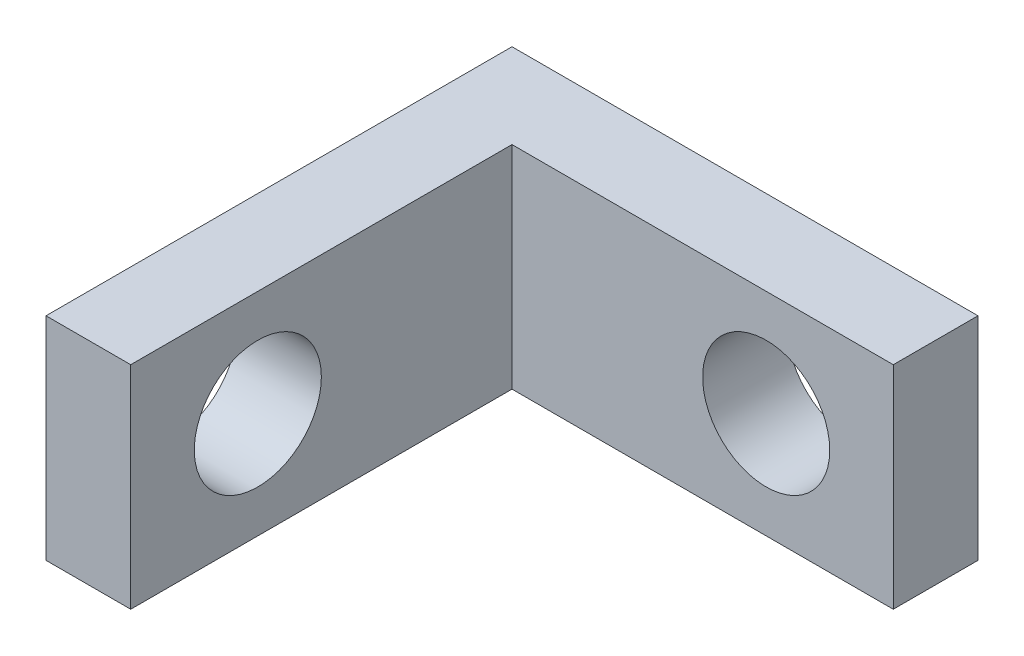
ISO-10303-21;
HEADER;
FILE_DESCRIPTION(('STEP AP214'),'2;1');
FILE_NAME('part.step','',(''),(''),'','','');
FILE_SCHEMA(('AUTOMOTIVE_DESIGN { 1 0 10303 214 1 1 1 1 }'));
ENDSEC;
DATA;
#1=APPLICATION_CONTEXT('core data for automotive mechanical design processes');
#2=APPLICATION_PROTOCOL_DEFINITION('international standard','automotive_design',2000,#1);
#3=PRODUCT_CONTEXT('',#1,'mechanical');
#4=PRODUCT('Part','Part','',(#3));
#5=PRODUCT_RELATED_PRODUCT_CATEGORY('part','',(#4));
#6=PRODUCT_DEFINITION_FORMATION('','',#4);
#7=PRODUCT_DEFINITION_CONTEXT('part definition',#1,'design');
#8=PRODUCT_DEFINITION('design','',#6,#7);
#9=PRODUCT_DEFINITION_SHAPE('','',#8);
#10=(LENGTH_UNIT() NAMED_UNIT(*) SI_UNIT(.MILLI.,.METRE.));
#11=(NAMED_UNIT(*) PLANE_ANGLE_UNIT() SI_UNIT($,.RADIAN.));
#12=(NAMED_UNIT(*) SI_UNIT($,.STERADIAN.) SOLID_ANGLE_UNIT());
#13=UNCERTAINTY_MEASURE_WITH_UNIT(LENGTH_MEASURE(1.E-05),#10,'distance_accuracy_value','');
#14=(GEOMETRIC_REPRESENTATION_CONTEXT(3) GLOBAL_UNCERTAINTY_ASSIGNED_CONTEXT((#13)) GLOBAL_UNIT_ASSIGNED_CONTEXT((#10,
#11,#12)) REPRESENTATION_CONTEXT('',''));
#15=CARTESIAN_POINT('',(0.,0.,0.));
#16=DIRECTION('',(0.,0.,1.));
#17=DIRECTION('',(1.,0.,0.));
#18=AXIS2_PLACEMENT_3D('',#15,#16,#17);
#19=CARTESIAN_POINT('',(2.,0.,0.));
#20=DIRECTION('',(-1.,0.,0.));
#21=DIRECTION('',(0.,0.,1.));
#22=AXIS2_PLACEMENT_3D('',#19,#20,#21);
#23=PLANE('',#22);
#24=CARTESIAN_POINT('',(2.,0.,8.));
#25=DIRECTION('',(1.,0.,0.));
#26=DIRECTION('',(0.,0.,-1.));
#27=AXIS2_PLACEMENT_3D('',#24,#25,#26);
#28=CIRCLE('',#27,1.5);
#29=CARTESIAN_POINT('',(2.,0.,6.5));
#30=VERTEX_POINT('',#29);
#31=EDGE_CURVE('E87',#30,#30,#28,.T.);
#32=ORIENTED_EDGE('',*,*,#31,.F.);
#33=EDGE_LOOP('',(#32));
#34=FACE_BOUND('',#33,.T.);
#35=DIRECTION('',(0.,-1.,0.));
#36=VECTOR('',#35,1.);
#37=CARTESIAN_POINT('',(2.,2.5,2.));
#38=LINE('',#37,#36);
#39=CARTESIAN_POINT('',(2.,2.5,2.));
#40=VERTEX_POINT('',#39);
#41=CARTESIAN_POINT('',(2.,-2.5,2.));
#42=VERTEX_POINT('',#41);
#43=EDGE_CURVE('E52',#40,#42,#38,.T.);
#44=ORIENTED_EDGE('',*,*,#43,.F.);
#45=DIRECTION('',(0.,0.,1.));
#46=VECTOR('',#45,1.);
#47=CARTESIAN_POINT('',(2.,2.5,11.));
#48=LINE('',#47,#46);
#49=CARTESIAN_POINT('',(2.,2.5,11.));
#50=VERTEX_POINT('',#49);
#51=EDGE_CURVE('E98',#40,#50,#48,.T.);
#52=ORIENTED_EDGE('',*,*,#51,.T.);
#53=DIRECTION('',(0.,-1.,0.));
#54=VECTOR('',#53,1.);
#55=CARTESIAN_POINT('',(2.,0.,11.));
#56=LINE('',#55,#54);
#57=CARTESIAN_POINT('',(2.,-2.5,11.));
#58=VERTEX_POINT('',#57);
#59=EDGE_CURVE('E58',#50,#58,#56,.T.);
#60=ORIENTED_EDGE('',*,*,#59,.T.);
#61=DIRECTION('',(0.,0.,-1.));
#62=VECTOR('',#61,1.);
#63=CARTESIAN_POINT('',(2.,-2.5,0.));
#64=LINE('',#63,#62);
#65=EDGE_CURVE('E104',#58,#42,#64,.T.);
#66=ORIENTED_EDGE('',*,*,#65,.T.);
#67=EDGE_LOOP('',(#44,#52,#60,#66));
#68=FACE_BOUND('',#67,.T.);
#69=ADVANCED_FACE('F37',(#34,#68),#23,.F.);
#70=CARTESIAN_POINT('',(0.,0.,0.));
#71=DIRECTION('',(-1.,0.,0.));
#72=DIRECTION('',(0.,0.,1.));
#73=AXIS2_PLACEMENT_3D('',#70,#71,#72);
#74=PLANE('',#73);
#75=DIRECTION('',(0.,1.,0.));
#76=VECTOR('',#75,1.);
#77=CARTESIAN_POINT('',(0.,2.5,0.));
#78=LINE('',#77,#76);
#79=CARTESIAN_POINT('',(0.,-2.5,0.));
#80=VERTEX_POINT('',#79);
#81=CARTESIAN_POINT('',(0.,2.5,0.));
#82=VERTEX_POINT('',#81);
#83=EDGE_CURVE('E77',#80,#82,#78,.T.);
#84=ORIENTED_EDGE('',*,*,#83,.F.);
#85=DIRECTION('',(0.,0.,-1.));
#86=VECTOR('',#85,1.);
#87=CARTESIAN_POINT('',(0.,-2.5,0.));
#88=LINE('',#87,#86);
#89=CARTESIAN_POINT('',(0.,-2.5,11.));
#90=VERTEX_POINT('',#89);
#91=EDGE_CURVE('E81',#90,#80,#88,.T.);
#92=ORIENTED_EDGE('',*,*,#91,.F.);
#93=DIRECTION('',(0.,-1.,0.));
#94=VECTOR('',#93,1.);
#95=CARTESIAN_POINT('',(0.,-2.5,11.));
#96=LINE('',#95,#94);
#97=CARTESIAN_POINT('',(0.,2.5,11.));
#98=VERTEX_POINT('',#97);
#99=EDGE_CURVE('E99',#98,#90,#96,.T.);
#100=ORIENTED_EDGE('',*,*,#99,.F.);
#101=DIRECTION('',(0.,0.,1.));
#102=VECTOR('',#101,1.);
#103=CARTESIAN_POINT('',(0.,2.5,11.));
#104=LINE('',#103,#102);
#105=EDGE_CURVE('E83',#82,#98,#104,.T.);
#106=ORIENTED_EDGE('',*,*,#105,.F.);
#107=EDGE_LOOP('',(#84,#92,#100,#106));
#108=FACE_BOUND('',#107,.T.);
#109=CARTESIAN_POINT('',(0.,0.,8.));
#110=DIRECTION('',(1.,0.,0.));
#111=DIRECTION('',(0.,0.,-1.));
#112=AXIS2_PLACEMENT_3D('',#109,#110,#111);
#113=CIRCLE('',#112,1.5);
#114=CARTESIAN_POINT('',(0.,0.,6.5));
#115=VERTEX_POINT('',#114);
#116=EDGE_CURVE('E122',#115,#115,#113,.T.);
#117=ORIENTED_EDGE('',*,*,#116,.T.);
#118=EDGE_LOOP('',(#117));
#119=FACE_BOUND('',#118,.T.);
#120=ADVANCED_FACE('F79',(#108,#119),#74,.T.);
#121=CARTESIAN_POINT('',(2.,2.5,0.));
#122=DIRECTION('',(0.,0.,1.));
#123=DIRECTION('',(1.,0.,0.));
#124=AXIS2_PLACEMENT_3D('',#121,#122,#123);
#125=PLANE('',#124);
#126=CARTESIAN_POINT('',(8.,0.,0.));
#127=DIRECTION('',(0.,0.,1.));
#128=DIRECTION('',(1.,0.,0.));
#129=AXIS2_PLACEMENT_3D('',#126,#127,#128);
#130=CIRCLE('',#129,1.5);
#131=CARTESIAN_POINT('',(9.5,0.,0.));
#132=VERTEX_POINT('',#131);
#133=EDGE_CURVE('E134',#132,#132,#130,.T.);
#134=ORIENTED_EDGE('',*,*,#133,.T.);
#135=EDGE_LOOP('',(#134));
#136=FACE_BOUND('',#135,.T.);
#137=ORIENTED_EDGE('',*,*,#83,.T.);
#138=DIRECTION('',(-1.,0.,0.));
#139=VECTOR('',#138,1.);
#140=CARTESIAN_POINT('',(2.,2.5,0.));
#141=LINE('',#140,#139);
#142=CARTESIAN_POINT('',(11.,2.5,0.));
#143=VERTEX_POINT('',#142);
#144=EDGE_CURVE('E11',#143,#82,#141,.T.);
#145=ORIENTED_EDGE('',*,*,#144,.F.);
#146=DIRECTION('',(0.,1.,0.));
#147=VECTOR('',#146,1.);
#148=CARTESIAN_POINT('',(11.,2.5,0.));
#149=LINE('',#148,#147);
#150=CARTESIAN_POINT('',(11.,-2.5,0.));
#151=VERTEX_POINT('',#150);
#152=EDGE_CURVE('E103',#151,#143,#149,.T.);
#153=ORIENTED_EDGE('',*,*,#152,.F.);
#154=DIRECTION('',(-1.,0.,0.));
#155=VECTOR('',#154,1.);
#156=CARTESIAN_POINT('',(2.,-2.5,0.));
#157=LINE('',#156,#155);
#158=EDGE_CURVE('E94',#151,#80,#157,.T.);
#159=ORIENTED_EDGE('',*,*,#158,.T.);
#160=EDGE_LOOP('',(#137,#145,#153,#159));
#161=FACE_BOUND('',#160,.T.);
#162=ADVANCED_FACE('F39',(#136,#161),#125,.F.);
#163=CARTESIAN_POINT('',(2.,2.5,11.));
#164=DIRECTION('',(0.,-1.,0.));
#165=DIRECTION('',(0.,0.,-1.));
#166=AXIS2_PLACEMENT_3D('',#163,#164,#165);
#167=PLANE('',#166);
#168=ORIENTED_EDGE('',*,*,#105,.T.);
#169=DIRECTION('',(-1.,0.,0.));
#170=VECTOR('',#169,1.);
#171=CARTESIAN_POINT('',(2.,2.5,11.));
#172=LINE('',#171,#170);
#173=EDGE_CURVE('E45',#50,#98,#172,.T.);
#174=ORIENTED_EDGE('',*,*,#173,.F.);
#175=ORIENTED_EDGE('',*,*,#51,.F.);
#176=DIRECTION('',(-1.,0.,0.));
#177=VECTOR('',#176,1.);
#178=CARTESIAN_POINT('',(11.,2.5,2.));
#179=LINE('',#178,#177);
#180=CARTESIAN_POINT('',(11.,2.5,2.));
#181=VERTEX_POINT('',#180);
#182=EDGE_CURVE('E125',#181,#40,#179,.T.);
#183=ORIENTED_EDGE('',*,*,#182,.F.);
#184=DIRECTION('',(0.,0.,1.));
#185=VECTOR('',#184,1.);
#186=CARTESIAN_POINT('',(11.,2.5,0.));
#187=LINE('',#186,#185);
#188=EDGE_CURVE('E139',#143,#181,#187,.T.);
#189=ORIENTED_EDGE('',*,*,#188,.F.);
#190=ORIENTED_EDGE('',*,*,#144,.T.);
#191=EDGE_LOOP('',(#168,#174,#175,#183,#189,#190));
#192=FACE_BOUND('',#191,.T.);
#193=ADVANCED_FACE('F114',(#192),#167,.F.);
#194=CARTESIAN_POINT('',(2.,-2.5,11.));
#195=DIRECTION('',(0.,0.,-1.));
#196=DIRECTION('',(-1.,0.,0.));
#197=AXIS2_PLACEMENT_3D('',#194,#195,#196);
#198=PLANE('',#197);
#199=ORIENTED_EDGE('',*,*,#99,.T.);
#200=DIRECTION('',(-1.,0.,0.));
#201=VECTOR('',#200,1.);
#202=CARTESIAN_POINT('',(2.,-2.5,11.));
#203=LINE('',#202,#201);
#204=EDGE_CURVE('E97',#58,#90,#203,.T.);
#205=ORIENTED_EDGE('',*,*,#204,.F.);
#206=ORIENTED_EDGE('',*,*,#59,.F.);
#207=ORIENTED_EDGE('',*,*,#173,.T.);
#208=EDGE_LOOP('',(#199,#205,#206,#207));
#209=FACE_BOUND('',#208,.T.);
#210=ADVANCED_FACE('F112',(#209),#198,.F.);
#211=CARTESIAN_POINT('',(2.,-2.5,0.));
#212=DIRECTION('',(0.,1.,0.));
#213=DIRECTION('',(0.,0.,1.));
#214=AXIS2_PLACEMENT_3D('',#211,#212,#213);
#215=PLANE('',#214);
#216=ORIENTED_EDGE('',*,*,#91,.T.);
#217=ORIENTED_EDGE('',*,*,#158,.F.);
#218=DIRECTION('',(0.,0.,-1.));
#219=VECTOR('',#218,1.);
#220=CARTESIAN_POINT('',(11.,-2.5,0.));
#221=LINE('',#220,#219);
#222=CARTESIAN_POINT('',(11.,-2.5,2.));
#223=VERTEX_POINT('',#222);
#224=EDGE_CURVE('E132',#223,#151,#221,.T.);
#225=ORIENTED_EDGE('',*,*,#224,.F.);
#226=DIRECTION('',(-1.,0.,0.));
#227=VECTOR('',#226,1.);
#228=CARTESIAN_POINT('',(11.,-2.5,2.));
#229=LINE('',#228,#227);
#230=EDGE_CURVE('E129',#223,#42,#229,.T.);
#231=ORIENTED_EDGE('',*,*,#230,.T.);
#232=ORIENTED_EDGE('',*,*,#65,.F.);
#233=ORIENTED_EDGE('',*,*,#204,.T.);
#234=EDGE_LOOP('',(#216,#217,#225,#231,#232,#233));
#235=FACE_BOUND('',#234,.T.);
#236=ADVANCED_FACE('F92',(#235),#215,.F.);
#237=CARTESIAN_POINT('',(2.,0.,8.));
#238=DIRECTION('',(-1.,0.,0.));
#239=DIRECTION('',(0.,0.,1.));
#240=AXIS2_PLACEMENT_3D('',#237,#238,#239);
#241=CYLINDRICAL_SURFACE('',#240,1.5);
#242=ORIENTED_EDGE('',*,*,#31,.T.);
#243=EDGE_LOOP('',(#242));
#244=FACE_BOUND('',#243,.T.);
#245=ORIENTED_EDGE('',*,*,#116,.F.);
#246=EDGE_LOOP('',(#245));
#247=FACE_BOUND('',#246,.T.);
#248=ADVANCED_FACE('F156',(#244,#247),#241,.F.);
#249=CARTESIAN_POINT('',(11.,2.5,2.));
#250=DIRECTION('',(0.,0.,-1.));
#251=DIRECTION('',(-1.,0.,0.));
#252=AXIS2_PLACEMENT_3D('',#249,#250,#251);
#253=PLANE('',#252);
#254=CARTESIAN_POINT('',(8.,0.,2.));
#255=DIRECTION('',(0.,0.,1.));
#256=DIRECTION('',(1.,0.,0.));
#257=AXIS2_PLACEMENT_3D('',#254,#255,#256);
#258=CIRCLE('',#257,1.5);
#259=CARTESIAN_POINT('',(9.5,0.,2.));
#260=VERTEX_POINT('',#259);
#261=EDGE_CURVE('E145',#260,#260,#258,.T.);
#262=ORIENTED_EDGE('',*,*,#261,.F.);
#263=EDGE_LOOP('',(#262));
#264=FACE_BOUND('',#263,.T.);
#265=ORIENTED_EDGE('',*,*,#43,.T.);
#266=ORIENTED_EDGE('',*,*,#230,.F.);
#267=DIRECTION('',(0.,-1.,0.));
#268=VECTOR('',#267,1.);
#269=CARTESIAN_POINT('',(11.,2.5,2.));
#270=LINE('',#269,#268);
#271=EDGE_CURVE('E136',#181,#223,#270,.T.);
#272=ORIENTED_EDGE('',*,*,#271,.F.);
#273=ORIENTED_EDGE('',*,*,#182,.T.);
#274=EDGE_LOOP('',(#265,#266,#272,#273));
#275=FACE_BOUND('',#274,.T.);
#276=ADVANCED_FACE('F152',(#264,#275),#253,.F.);
#277=CARTESIAN_POINT('',(11.,0.,0.));
#278=DIRECTION('',(-1.,0.,0.));
#279=DIRECTION('',(0.,0.,1.));
#280=AXIS2_PLACEMENT_3D('',#277,#278,#279);
#281=PLANE('',#280);
#282=ORIENTED_EDGE('',*,*,#152,.T.);
#283=ORIENTED_EDGE('',*,*,#188,.T.);
#284=ORIENTED_EDGE('',*,*,#271,.T.);
#285=ORIENTED_EDGE('',*,*,#224,.T.);
#286=EDGE_LOOP('',(#282,#283,#284,#285));
#287=FACE_BOUND('',#286,.T.);
#288=ADVANCED_FACE('F155',(#287),#281,.F.);
#289=CARTESIAN_POINT('',(8.,0.,-4.));
#290=DIRECTION('',(0.,0.,1.));
#291=DIRECTION('',(1.,0.,0.));
#292=AXIS2_PLACEMENT_3D('',#289,#290,#291);
#293=CYLINDRICAL_SURFACE('',#292,1.5);
#294=ORIENTED_EDGE('',*,*,#261,.T.);
#295=EDGE_LOOP('',(#294));
#296=FACE_BOUND('',#295,.T.);
#297=ORIENTED_EDGE('',*,*,#133,.F.);
#298=EDGE_LOOP('',(#297));
#299=FACE_BOUND('',#298,.T.);
#300=ADVANCED_FACE('F149',(#296,#299),#293,.F.);
#301=CLOSED_SHELL('',(#69,#120,#162,#193,#210,#236,#248,#276,#288,#300));
#302=MANIFOLD_SOLID_BREP('B2',#301);
#303=ADVANCED_BREP_SHAPE_REPRESENTATION('',(#18,#302),#14);
#304=SHAPE_DEFINITION_REPRESENTATION(#9,#303);
ENDSEC;
END-ISO-10303-21;
